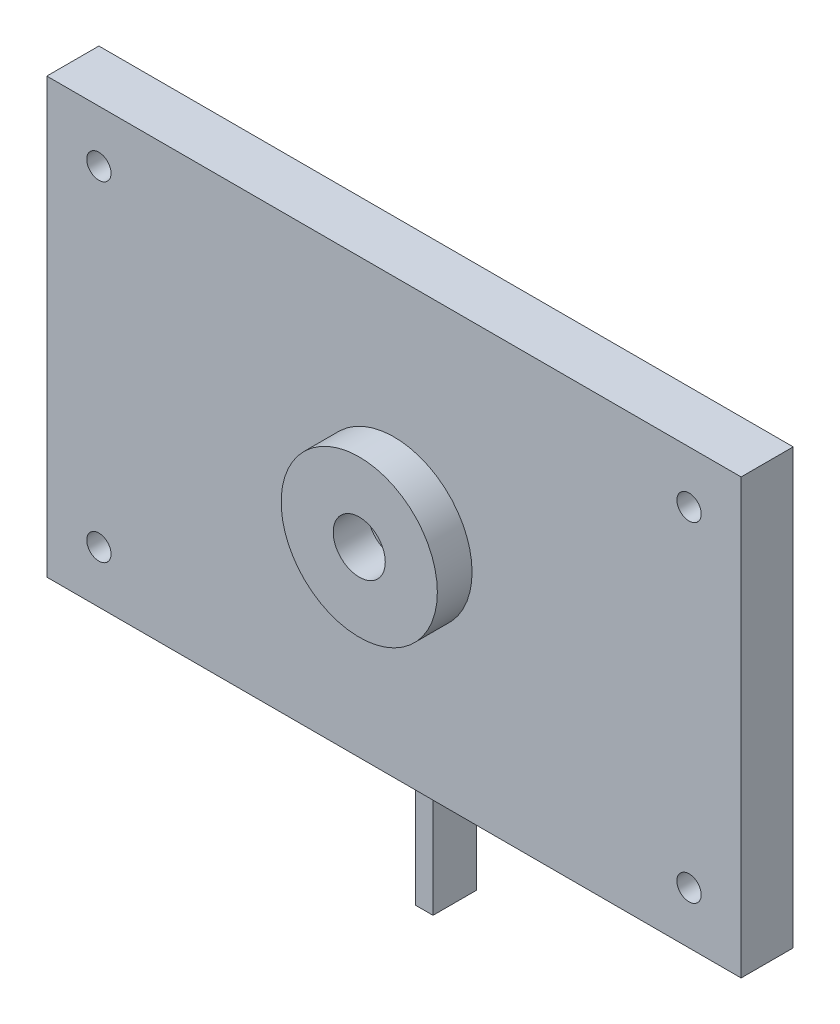
ISO-10303-21;
HEADER;
FILE_DESCRIPTION(('STEP AP214'),'2;1');
FILE_NAME('part.step','',(''),(''),'','','');
FILE_SCHEMA(('AUTOMOTIVE_DESIGN { 1 0 10303 214 1 1 1 1 }'));
ENDSEC;
DATA;
#1=APPLICATION_CONTEXT('core data for automotive mechanical design processes');
#2=APPLICATION_PROTOCOL_DEFINITION('international standard','automotive_design',2000,#1);
#3=PRODUCT_CONTEXT('',#1,'mechanical');
#4=PRODUCT('Part','Part','',(#3));
#5=PRODUCT_RELATED_PRODUCT_CATEGORY('part','',(#4));
#6=PRODUCT_DEFINITION_FORMATION('','',#4);
#7=PRODUCT_DEFINITION_CONTEXT('part definition',#1,'design');
#8=PRODUCT_DEFINITION('design','',#6,#7);
#9=PRODUCT_DEFINITION_SHAPE('','',#8);
#10=(LENGTH_UNIT() NAMED_UNIT(*) SI_UNIT(.MILLI.,.METRE.));
#11=(NAMED_UNIT(*) PLANE_ANGLE_UNIT() SI_UNIT($,.RADIAN.));
#12=(NAMED_UNIT(*) SI_UNIT($,.STERADIAN.) SOLID_ANGLE_UNIT());
#13=UNCERTAINTY_MEASURE_WITH_UNIT(LENGTH_MEASURE(1.E-05),#10,'distance_accuracy_value','');
#14=(GEOMETRIC_REPRESENTATION_CONTEXT(3) GLOBAL_UNCERTAINTY_ASSIGNED_CONTEXT((#13)) GLOBAL_UNIT_ASSIGNED_CONTEXT((#10,
#11,#12)) REPRESENTATION_CONTEXT('',''));
#15=CARTESIAN_POINT('',(0.,0.,0.));
#16=DIRECTION('',(0.,0.,1.));
#17=DIRECTION('',(1.,0.,0.));
#18=AXIS2_PLACEMENT_3D('',#15,#16,#17);
#19=CARTESIAN_POINT('',(0.,0.,30.));
#20=DIRECTION('',(0.,0.,1.));
#21=DIRECTION('',(1.,0.,0.));
#22=AXIS2_PLACEMENT_3D('',#19,#20,#21);
#23=PLANE('',#22);
#24=CARTESIAN_POINT('',(0.,0.,30.));
#25=DIRECTION('',(0.,0.,-1.));
#26=DIRECTION('',(1.,0.,0.));
#27=AXIS2_PLACEMENT_3D('',#24,#25,#26);
#28=CIRCLE('',#27,15.);
#29=CARTESIAN_POINT('',(15.,0.,30.));
#30=VERTEX_POINT('',#29);
#31=EDGE_CURVE('E10',#30,#30,#28,.T.);
#32=ORIENTED_EDGE('',*,*,#31,.F.);
#33=EDGE_LOOP('',(#32));
#34=FACE_BOUND('',#33,.T.);
#35=ADVANCED_FACE('F16',(#34),#23,.T.);
#36=CARTESIAN_POINT('',(0.,0.,0.));
#37=DIRECTION('',(0.,0.,-1.));
#38=DIRECTION('',(1.,0.,0.));
#39=AXIS2_PLACEMENT_3D('',#36,#37,#38);
#40=CYLINDRICAL_SURFACE('',#39,15.);
#41=DIRECTION('',(0.,0.,1.));
#42=VECTOR('',#41,1.);
#43=CARTESIAN_POINT('',(15.,0.,0.));
#44=LINE('',#43,#42);
#45=CARTESIAN_POINT('',(15.,0.,50.));
#46=VERTEX_POINT('',#45);
#47=EDGE_CURVE('E24',#30,#46,#44,.T.);
#48=ORIENTED_EDGE('',*,*,#47,.F.);
#49=ORIENTED_EDGE('',*,*,#31,.T.);
#50=ORIENTED_EDGE('',*,*,#47,.T.);
#51=CARTESIAN_POINT('',(0.,0.,50.));
#52=DIRECTION('',(0.,0.,-1.));
#53=DIRECTION('',(1.,0.,0.));
#54=AXIS2_PLACEMENT_3D('',#51,#52,#53);
#55=CIRCLE('',#54,15.);
#56=EDGE_CURVE('E308',#46,#46,#55,.T.);
#57=ORIENTED_EDGE('',*,*,#56,.F.);
#58=EDGE_LOOP('',(#48,#49,#50,#57));
#59=FACE_BOUND('',#58,.T.);
#60=ADVANCED_FACE('F340',(#59),#40,.F.);
#61=CARTESIAN_POINT('',(0.,0.,50.));
#62=DIRECTION('',(0.,0.,1.));
#63=DIRECTION('',(1.,0.,0.));
#64=AXIS2_PLACEMENT_3D('',#61,#62,#63);
#65=PLANE('',#64);
#66=ORIENTED_EDGE('',*,*,#56,.T.);
#67=EDGE_LOOP('',(#66));
#68=FACE_BOUND('',#67,.T.);
#69=CARTESIAN_POINT('',(0.,0.,50.));
#70=DIRECTION('',(0.,0.,1.));
#71=DIRECTION('',(1.,0.,0.));
#72=AXIS2_PLACEMENT_3D('',#69,#70,#71);
#73=CIRCLE('',#72,45.);
#74=CARTESIAN_POINT('',(45.,0.,50.));
#75=VERTEX_POINT('',#74);
#76=EDGE_CURVE('E333',#75,#75,#73,.T.);
#77=ORIENTED_EDGE('',*,*,#76,.T.);
#78=EDGE_LOOP('',(#77));
#79=FACE_BOUND('',#78,.T.);
#80=ADVANCED_FACE('F338',(#68,#79),#65,.T.);
#81=CARTESIAN_POINT('',(0.,0.,0.));
#82=DIRECTION('',(0.,0.,1.));
#83=DIRECTION('',(1.,0.,0.));
#84=AXIS2_PLACEMENT_3D('',#81,#82,#83);
#85=CYLINDRICAL_SURFACE('',#84,45.);
#86=DIRECTION('',(0.,0.,1.));
#87=VECTOR('',#86,1.);
#88=CARTESIAN_POINT('',(45.,0.,0.));
#89=LINE('',#88,#87);
#90=CARTESIAN_POINT('',(45.,0.,30.));
#91=VERTEX_POINT('',#90);
#92=EDGE_CURVE('E301',#91,#75,#89,.T.);
#93=ORIENTED_EDGE('',*,*,#92,.F.);
#94=CARTESIAN_POINT('',(0.,0.,30.));
#95=DIRECTION('',(0.,0.,1.));
#96=DIRECTION('',(1.,0.,0.));
#97=AXIS2_PLACEMENT_3D('',#94,#95,#96);
#98=CIRCLE('',#97,45.);
#99=EDGE_CURVE('E222',#91,#91,#98,.T.);
#100=ORIENTED_EDGE('',*,*,#99,.T.);
#101=ORIENTED_EDGE('',*,*,#92,.T.);
#102=ORIENTED_EDGE('',*,*,#76,.F.);
#103=EDGE_LOOP('',(#93,#100,#101,#102));
#104=FACE_BOUND('',#103,.T.);
#105=ADVANCED_FACE('F347',(#104),#85,.T.);
#106=CARTESIAN_POINT('',(0.,0.,0.));
#107=DIRECTION('',(0.,-1.,0.));
#108=DIRECTION('',(0.,0.,-1.));
#109=AXIS2_PLACEMENT_3D('',#106,#107,#108);
#110=PLANE('',#109);
#111=DIRECTION('',(1.,0.,0.));
#112=VECTOR('',#111,1.);
#113=CARTESIAN_POINT('',(0.,0.,0.));
#114=LINE('',#113,#112);
#115=CARTESIAN_POINT('',(-5.,0.,0.));
#116=VERTEX_POINT('',#115);
#117=CARTESIAN_POINT('',(5.,0.,0.));
#118=VERTEX_POINT('',#117);
#119=EDGE_CURVE('E239',#116,#118,#114,.T.);
#120=ORIENTED_EDGE('',*,*,#119,.T.);
#121=DIRECTION('',(0.,0.,1.));
#122=VECTOR('',#121,1.);
#123=CARTESIAN_POINT('',(5.,0.,-12.5));
#124=LINE('',#123,#122);
#125=CARTESIAN_POINT('',(5.,0.,-12.5));
#126=VERTEX_POINT('',#125);
#127=EDGE_CURVE('E277',#126,#118,#124,.T.);
#128=ORIENTED_EDGE('',*,*,#127,.F.);
#129=DIRECTION('',(1.,0.,0.));
#130=VECTOR('',#129,1.);
#131=CARTESIAN_POINT('',(-5.,0.,-12.5));
#132=LINE('',#131,#130);
#133=CARTESIAN_POINT('',(-5.,0.,-12.5));
#134=VERTEX_POINT('',#133);
#135=EDGE_CURVE('E298',#134,#126,#132,.T.);
#136=ORIENTED_EDGE('',*,*,#135,.F.);
#137=DIRECTION('',(0.,0.,-1.));
#138=VECTOR('',#137,1.);
#139=CARTESIAN_POINT('',(-5.,0.,12.5));
#140=LINE('',#139,#138);
#141=EDGE_CURVE('E263',#116,#134,#140,.T.);
#142=ORIENTED_EDGE('',*,*,#141,.F.);
#143=EDGE_LOOP('',(#120,#128,#136,#142));
#144=FACE_BOUND('',#143,.T.);
#145=ADVANCED_FACE('F389',(#144),#110,.F.);
#146=CARTESIAN_POINT('',(-5.,0.,-12.5));
#147=DIRECTION('',(0.,0.,1.));
#148=DIRECTION('',(1.,0.,0.));
#149=AXIS2_PLACEMENT_3D('',#146,#147,#148);
#150=PLANE('',#149);
#151=ORIENTED_EDGE('',*,*,#135,.T.);
#152=DIRECTION('',(0.,-1.,0.));
#153=VECTOR('',#152,1.);
#154=CARTESIAN_POINT('',(5.,0.,-12.5));
#155=LINE('',#154,#153);
#156=CARTESIAN_POINT('',(5.,-200.,-12.5));
#157=VERTEX_POINT('',#156);
#158=EDGE_CURVE('E225',#126,#157,#155,.T.);
#159=ORIENTED_EDGE('',*,*,#158,.T.);
#160=DIRECTION('',(1.,0.,0.));
#161=VECTOR('',#160,1.);
#162=CARTESIAN_POINT('',(-5.,-200.,-12.5));
#163=LINE('',#162,#161);
#164=CARTESIAN_POINT('',(-5.,-200.,-12.5));
#165=VERTEX_POINT('',#164);
#166=EDGE_CURVE('E211',#165,#157,#163,.T.);
#167=ORIENTED_EDGE('',*,*,#166,.F.);
#168=DIRECTION('',(0.,-1.,0.));
#169=VECTOR('',#168,1.);
#170=CARTESIAN_POINT('',(-5.,0.,-12.5));
#171=LINE('',#170,#169);
#172=EDGE_CURVE('E267',#134,#165,#171,.T.);
#173=ORIENTED_EDGE('',*,*,#172,.F.);
#174=EDGE_LOOP('',(#151,#159,#167,#173));
#175=FACE_BOUND('',#174,.T.);
#176=ADVANCED_FACE('F355',(#175),#150,.F.);
#177=CARTESIAN_POINT('',(0.,-200.,0.));
#178=DIRECTION('',(0.,-1.,0.));
#179=DIRECTION('',(0.,0.,-1.));
#180=AXIS2_PLACEMENT_3D('',#177,#178,#179);
#181=PLANE('',#180);
#182=ORIENTED_EDGE('',*,*,#166,.T.);
#183=DIRECTION('',(0.,0.,1.));
#184=VECTOR('',#183,1.);
#185=CARTESIAN_POINT('',(5.,-200.,-12.5));
#186=LINE('',#185,#184);
#187=CARTESIAN_POINT('',(5.,-200.,12.5));
#188=VERTEX_POINT('',#187);
#189=EDGE_CURVE('E175',#157,#188,#186,.T.);
#190=ORIENTED_EDGE('',*,*,#189,.T.);
#191=DIRECTION('',(-1.,0.,0.));
#192=VECTOR('',#191,1.);
#193=CARTESIAN_POINT('',(5.,-200.,12.5));
#194=LINE('',#193,#192);
#195=CARTESIAN_POINT('',(-5.,-200.,12.5));
#196=VERTEX_POINT('',#195);
#197=EDGE_CURVE('E171',#188,#196,#194,.T.);
#198=ORIENTED_EDGE('',*,*,#197,.T.);
#199=DIRECTION('',(0.,0.,-1.));
#200=VECTOR('',#199,1.);
#201=CARTESIAN_POINT('',(-5.,-200.,12.5));
#202=LINE('',#201,#200);
#203=EDGE_CURVE('E268',#196,#165,#202,.T.);
#204=ORIENTED_EDGE('',*,*,#203,.T.);
#205=EDGE_LOOP('',(#182,#190,#198,#204));
#206=FACE_BOUND('',#205,.T.);
#207=ADVANCED_FACE('F351',(#206),#181,.T.);
#208=CARTESIAN_POINT('',(170.,95.,0.));
#209=DIRECTION('',(0.,0.,-1.));
#210=DIRECTION('',(1.,0.,0.));
#211=AXIS2_PLACEMENT_3D('',#208,#209,#210);
#212=CYLINDRICAL_SURFACE('',#211,7.);
#213=CARTESIAN_POINT('',(170.,95.,0.));
#214=DIRECTION('',(0.,0.,1.));
#215=DIRECTION('',(1.,0.,0.));
#216=AXIS2_PLACEMENT_3D('',#213,#214,#215);
#217=CIRCLE('',#216,7.);
#218=CARTESIAN_POINT('',(177.,95.,0.));
#219=VERTEX_POINT('',#218);
#220=EDGE_CURVE('E259',#219,#219,#217,.T.);
#221=ORIENTED_EDGE('',*,*,#220,.F.);
#222=DIRECTION('',(0.,0.,1.));
#223=VECTOR('',#222,1.);
#224=CARTESIAN_POINT('',(177.,95.,0.));
#225=LINE('',#224,#223);
#226=CARTESIAN_POINT('',(177.,95.,30.));
#227=VERTEX_POINT('',#226);
#228=EDGE_CURVE('E208',#219,#227,#225,.T.);
#229=ORIENTED_EDGE('',*,*,#228,.T.);
#230=CARTESIAN_POINT('',(170.,95.,30.));
#231=DIRECTION('',(0.,0.,-1.));
#232=DIRECTION('',(1.,0.,0.));
#233=AXIS2_PLACEMENT_3D('',#230,#231,#232);
#234=CIRCLE('',#233,7.);
#235=EDGE_CURVE('E217',#227,#227,#234,.T.);
#236=ORIENTED_EDGE('',*,*,#235,.F.);
#237=ORIENTED_EDGE('',*,*,#228,.F.);
#238=EDGE_LOOP('',(#221,#229,#236,#237));
#239=FACE_BOUND('',#238,.T.);
#240=ADVANCED_FACE('F354',(#239),#212,.F.);
#241=CARTESIAN_POINT('',(-170.,95.,0.));
#242=DIRECTION('',(0.,0.,-1.));
#243=DIRECTION('',(1.,0.,0.));
#244=AXIS2_PLACEMENT_3D('',#241,#242,#243);
#245=CYLINDRICAL_SURFACE('',#244,7.);
#246=CARTESIAN_POINT('',(-170.,95.,0.));
#247=DIRECTION('',(0.,0.,1.));
#248=DIRECTION('',(1.,0.,0.));
#249=AXIS2_PLACEMENT_3D('',#246,#247,#248);
#250=CIRCLE('',#249,7.);
#251=CARTESIAN_POINT('',(-163.,95.,0.));
#252=VERTEX_POINT('',#251);
#253=EDGE_CURVE('E244',#252,#252,#250,.T.);
#254=ORIENTED_EDGE('',*,*,#253,.F.);
#255=DIRECTION('',(0.,0.,1.));
#256=VECTOR('',#255,1.);
#257=CARTESIAN_POINT('',(-163.,95.,0.));
#258=LINE('',#257,#256);
#259=CARTESIAN_POINT('',(-163.,95.,30.));
#260=VERTEX_POINT('',#259);
#261=EDGE_CURVE('E212',#252,#260,#258,.T.);
#262=ORIENTED_EDGE('',*,*,#261,.T.);
#263=CARTESIAN_POINT('',(-170.,95.,30.));
#264=DIRECTION('',(0.,0.,-1.));
#265=DIRECTION('',(1.,0.,0.));
#266=AXIS2_PLACEMENT_3D('',#263,#264,#265);
#267=CIRCLE('',#266,7.);
#268=EDGE_CURVE('E292',#260,#260,#267,.T.);
#269=ORIENTED_EDGE('',*,*,#268,.F.);
#270=ORIENTED_EDGE('',*,*,#261,.F.);
#271=EDGE_LOOP('',(#254,#262,#269,#270));
#272=FACE_BOUND('',#271,.T.);
#273=ADVANCED_FACE('F359',(#272),#245,.F.);
#274=CARTESIAN_POINT('',(170.,-95.,0.));
#275=DIRECTION('',(0.,0.,-1.));
#276=DIRECTION('',(1.,0.,0.));
#277=AXIS2_PLACEMENT_3D('',#274,#275,#276);
#278=CYLINDRICAL_SURFACE('',#277,7.);
#279=CARTESIAN_POINT('',(170.,-95.,0.));
#280=DIRECTION('',(0.,0.,1.));
#281=DIRECTION('',(1.,0.,0.));
#282=AXIS2_PLACEMENT_3D('',#279,#280,#281);
#283=CIRCLE('',#282,7.);
#284=CARTESIAN_POINT('',(177.,-95.,0.));
#285=VERTEX_POINT('',#284);
#286=EDGE_CURVE('E240',#285,#285,#283,.T.);
#287=ORIENTED_EDGE('',*,*,#286,.F.);
#288=DIRECTION('',(0.,0.,1.));
#289=VECTOR('',#288,1.);
#290=CARTESIAN_POINT('',(177.,-95.,0.));
#291=LINE('',#290,#289);
#292=CARTESIAN_POINT('',(177.,-95.,30.));
#293=VERTEX_POINT('',#292);
#294=EDGE_CURVE('E323',#285,#293,#291,.T.);
#295=ORIENTED_EDGE('',*,*,#294,.T.);
#296=CARTESIAN_POINT('',(170.,-95.,30.));
#297=DIRECTION('',(0.,0.,-1.));
#298=DIRECTION('',(1.,0.,0.));
#299=AXIS2_PLACEMENT_3D('',#296,#297,#298);
#300=CIRCLE('',#299,7.);
#301=EDGE_CURVE('E288',#293,#293,#300,.T.);
#302=ORIENTED_EDGE('',*,*,#301,.F.);
#303=ORIENTED_EDGE('',*,*,#294,.F.);
#304=EDGE_LOOP('',(#287,#295,#302,#303));
#305=FACE_BOUND('',#304,.T.);
#306=ADVANCED_FACE('F365',(#305),#278,.F.);
#307=CARTESIAN_POINT('',(-170.,-95.,0.));
#308=DIRECTION('',(0.,0.,-1.));
#309=DIRECTION('',(1.,0.,0.));
#310=AXIS2_PLACEMENT_3D('',#307,#308,#309);
#311=CYLINDRICAL_SURFACE('',#310,7.);
#312=CARTESIAN_POINT('',(-170.,-95.,0.));
#313=DIRECTION('',(0.,0.,1.));
#314=DIRECTION('',(1.,0.,0.));
#315=AXIS2_PLACEMENT_3D('',#312,#313,#314);
#316=CIRCLE('',#315,7.);
#317=CARTESIAN_POINT('',(-163.,-95.,0.));
#318=VERTEX_POINT('',#317);
#319=EDGE_CURVE('E206',#318,#318,#316,.T.);
#320=ORIENTED_EDGE('',*,*,#319,.F.);
#321=DIRECTION('',(0.,0.,1.));
#322=VECTOR('',#321,1.);
#323=CARTESIAN_POINT('',(-163.,-95.,0.));
#324=LINE('',#323,#322);
#325=CARTESIAN_POINT('',(-163.,-95.,30.));
#326=VERTEX_POINT('',#325);
#327=EDGE_CURVE('E320',#318,#326,#324,.T.);
#328=ORIENTED_EDGE('',*,*,#327,.T.);
#329=CARTESIAN_POINT('',(-170.,-95.,30.));
#330=DIRECTION('',(0.,0.,-1.));
#331=DIRECTION('',(1.,0.,0.));
#332=AXIS2_PLACEMENT_3D('',#329,#330,#331);
#333=CIRCLE('',#332,7.);
#334=EDGE_CURVE('E293',#326,#326,#333,.T.);
#335=ORIENTED_EDGE('',*,*,#334,.F.);
#336=ORIENTED_EDGE('',*,*,#327,.F.);
#337=EDGE_LOOP('',(#320,#328,#335,#336));
#338=FACE_BOUND('',#337,.T.);
#339=ADVANCED_FACE('F361',(#338),#311,.F.);
#340=CARTESIAN_POINT('',(200.,125.,0.));
#341=DIRECTION('',(0.,-1.,0.));
#342=DIRECTION('',(0.,0.,-1.));
#343=AXIS2_PLACEMENT_3D('',#340,#341,#342);
#344=PLANE('',#343);
#345=DIRECTION('',(-1.,0.,0.));
#346=VECTOR('',#345,1.);
#347=CARTESIAN_POINT('',(200.,125.,0.));
#348=LINE('',#347,#346);
#349=CARTESIAN_POINT('',(200.,125.,0.));
#350=VERTEX_POINT('',#349);
#351=CARTESIAN_POINT('',(-200.,125.,0.));
#352=VERTEX_POINT('',#351);
#353=EDGE_CURVE('E207',#350,#352,#348,.T.);
#354=ORIENTED_EDGE('',*,*,#353,.T.);
#355=DIRECTION('',(0.,0.,1.));
#356=VECTOR('',#355,1.);
#357=CARTESIAN_POINT('',(-200.,125.,0.));
#358=LINE('',#357,#356);
#359=CARTESIAN_POINT('',(-200.,125.,30.));
#360=VERTEX_POINT('',#359);
#361=EDGE_CURVE('E221',#352,#360,#358,.T.);
#362=ORIENTED_EDGE('',*,*,#361,.T.);
#363=DIRECTION('',(-1.,0.,0.));
#364=VECTOR('',#363,1.);
#365=CARTESIAN_POINT('',(200.,125.,30.));
#366=LINE('',#365,#364);
#367=CARTESIAN_POINT('',(200.,125.,30.));
#368=VERTEX_POINT('',#367);
#369=EDGE_CURVE('E297',#368,#360,#366,.T.);
#370=ORIENTED_EDGE('',*,*,#369,.F.);
#371=DIRECTION('',(0.,0.,1.));
#372=VECTOR('',#371,1.);
#373=CARTESIAN_POINT('',(200.,125.,0.));
#374=LINE('',#373,#372);
#375=EDGE_CURVE('E279',#350,#368,#374,.T.);
#376=ORIENTED_EDGE('',*,*,#375,.F.);
#377=EDGE_LOOP('',(#354,#362,#370,#376));
#378=FACE_BOUND('',#377,.T.);
#379=ADVANCED_FACE('F364',(#378),#344,.F.);
#380=CARTESIAN_POINT('',(-200.,125.,0.));
#381=DIRECTION('',(1.,0.,0.));
#382=DIRECTION('',(0.,1.,0.));
#383=AXIS2_PLACEMENT_3D('',#380,#381,#382);
#384=PLANE('',#383);
#385=DIRECTION('',(0.,-1.,0.));
#386=VECTOR('',#385,1.);
#387=CARTESIAN_POINT('',(-200.,125.,0.));
#388=LINE('',#387,#386);
#389=CARTESIAN_POINT('',(-200.,-125.,0.));
#390=VERTEX_POINT('',#389);
#391=EDGE_CURVE('E233',#352,#390,#388,.T.);
#392=ORIENTED_EDGE('',*,*,#391,.T.);
#393=DIRECTION('',(0.,0.,1.));
#394=VECTOR('',#393,1.);
#395=CARTESIAN_POINT('',(-200.,-125.,0.));
#396=LINE('',#395,#394);
#397=CARTESIAN_POINT('',(-200.,-125.,30.));
#398=VERTEX_POINT('',#397);
#399=EDGE_CURVE('E215',#390,#398,#396,.T.);
#400=ORIENTED_EDGE('',*,*,#399,.T.);
#401=DIRECTION('',(0.,-1.,0.));
#402=VECTOR('',#401,1.);
#403=CARTESIAN_POINT('',(-200.,125.,30.));
#404=LINE('',#403,#402);
#405=EDGE_CURVE('E305',#360,#398,#404,.T.);
#406=ORIENTED_EDGE('',*,*,#405,.F.);
#407=ORIENTED_EDGE('',*,*,#361,.F.);
#408=EDGE_LOOP('',(#392,#400,#406,#407));
#409=FACE_BOUND('',#408,.T.);
#410=ADVANCED_FACE('F367',(#409),#384,.F.);
#411=CARTESIAN_POINT('',(0.,0.,30.));
#412=DIRECTION('',(0.,0.,1.));
#413=DIRECTION('',(1.,0.,0.));
#414=AXIS2_PLACEMENT_3D('',#411,#412,#413);
#415=PLANE('',#414);
#416=ORIENTED_EDGE('',*,*,#235,.T.);
#417=EDGE_LOOP('',(#416));
#418=FACE_BOUND('',#417,.T.);
#419=ORIENTED_EDGE('',*,*,#99,.F.);
#420=EDGE_LOOP('',(#419));
#421=FACE_BOUND('',#420,.T.);
#422=ORIENTED_EDGE('',*,*,#268,.T.);
#423=EDGE_LOOP('',(#422));
#424=FACE_BOUND('',#423,.T.);
#425=ORIENTED_EDGE('',*,*,#301,.T.);
#426=EDGE_LOOP('',(#425));
#427=FACE_BOUND('',#426,.T.);
#428=ORIENTED_EDGE('',*,*,#334,.T.);
#429=EDGE_LOOP('',(#428));
#430=FACE_BOUND('',#429,.T.);
#431=DIRECTION('',(1.,0.,0.));
#432=VECTOR('',#431,1.);
#433=CARTESIAN_POINT('',(-200.,-125.,30.));
#434=LINE('',#433,#432);
#435=CARTESIAN_POINT('',(200.,-125.,30.));
#436=VERTEX_POINT('',#435);
#437=EDGE_CURVE('E226',#398,#436,#434,.T.);
#438=ORIENTED_EDGE('',*,*,#437,.T.);
#439=DIRECTION('',(0.,1.,0.));
#440=VECTOR('',#439,1.);
#441=CARTESIAN_POINT('',(200.,-125.,30.));
#442=LINE('',#441,#440);
#443=EDGE_CURVE('E287',#436,#368,#442,.T.);
#444=ORIENTED_EDGE('',*,*,#443,.T.);
#445=ORIENTED_EDGE('',*,*,#369,.T.);
#446=ORIENTED_EDGE('',*,*,#405,.T.);
#447=EDGE_LOOP('',(#438,#444,#445,#446));
#448=FACE_BOUND('',#447,.T.);
#449=ADVANCED_FACE('F370',(#418,#421,#424,#427,#430,#448),#415,.T.);
#450=CARTESIAN_POINT('',(200.,-125.,0.));
#451=DIRECTION('',(-1.,0.,0.));
#452=DIRECTION('',(0.,0.,1.));
#453=AXIS2_PLACEMENT_3D('',#450,#451,#452);
#454=PLANE('',#453);
#455=DIRECTION('',(0.,1.,0.));
#456=VECTOR('',#455,1.);
#457=CARTESIAN_POINT('',(200.,-125.,0.));
#458=LINE('',#457,#456);
#459=CARTESIAN_POINT('',(200.,-125.,0.));
#460=VERTEX_POINT('',#459);
#461=EDGE_CURVE('E203',#460,#350,#458,.T.);
#462=ORIENTED_EDGE('',*,*,#461,.T.);
#463=ORIENTED_EDGE('',*,*,#375,.T.);
#464=ORIENTED_EDGE('',*,*,#443,.F.);
#465=DIRECTION('',(0.,0.,1.));
#466=VECTOR('',#465,1.);
#467=CARTESIAN_POINT('',(200.,-125.,0.));
#468=LINE('',#467,#466);
#469=EDGE_CURVE('E201',#460,#436,#468,.T.);
#470=ORIENTED_EDGE('',*,*,#469,.F.);
#471=EDGE_LOOP('',(#462,#463,#464,#470));
#472=FACE_BOUND('',#471,.T.);
#473=ADVANCED_FACE('F374',(#472),#454,.F.);
#474=CARTESIAN_POINT('',(5.,0.,-12.5));
#475=DIRECTION('',(-1.,0.,0.));
#476=DIRECTION('',(0.,0.,1.));
#477=AXIS2_PLACEMENT_3D('',#474,#475,#476);
#478=PLANE('',#477);
#479=DIRECTION('',(0.,1.,0.));
#480=VECTOR('',#479,1.);
#481=CARTESIAN_POINT('',(5.,-125.,0.));
#482=LINE('',#481,#480);
#483=CARTESIAN_POINT('',(5.,-125.,0.));
#484=VERTEX_POINT('',#483);
#485=EDGE_CURVE('E181',#484,#118,#482,.T.);
#486=ORIENTED_EDGE('',*,*,#485,.F.);
#487=DIRECTION('',(0.,0.,1.));
#488=VECTOR('',#487,1.);
#489=CARTESIAN_POINT('',(5.,-125.,-6.25));
#490=LINE('',#489,#488);
#491=CARTESIAN_POINT('',(5.,-125.,12.5));
#492=VERTEX_POINT('',#491);
#493=EDGE_CURVE('E178',#484,#492,#490,.T.);
#494=ORIENTED_EDGE('',*,*,#493,.T.);
#495=DIRECTION('',(0.,-1.,0.));
#496=VECTOR('',#495,1.);
#497=CARTESIAN_POINT('',(5.,0.,12.5));
#498=LINE('',#497,#496);
#499=EDGE_CURVE('E164',#492,#188,#498,.T.);
#500=ORIENTED_EDGE('',*,*,#499,.T.);
#501=ORIENTED_EDGE('',*,*,#189,.F.);
#502=ORIENTED_EDGE('',*,*,#158,.F.);
#503=ORIENTED_EDGE('',*,*,#127,.T.);
#504=EDGE_LOOP('',(#486,#494,#500,#501,#502,#503));
#505=FACE_BOUND('',#504,.T.);
#506=ADVANCED_FACE('F179',(#505),#478,.F.);
#507=CARTESIAN_POINT('',(5.,0.,12.5));
#508=DIRECTION('',(0.,0.,-1.));
#509=DIRECTION('',(0.,-1.,0.));
#510=AXIS2_PLACEMENT_3D('',#507,#508,#509);
#511=PLANE('',#510);
#512=DIRECTION('',(0.,-1.,0.));
#513=VECTOR('',#512,1.);
#514=CARTESIAN_POINT('',(-5.,0.,12.5));
#515=LINE('',#514,#513);
#516=CARTESIAN_POINT('',(-5.,-125.,12.5));
#517=VERTEX_POINT('',#516);
#518=EDGE_CURVE('E272',#517,#196,#515,.T.);
#519=ORIENTED_EDGE('',*,*,#518,.T.);
#520=ORIENTED_EDGE('',*,*,#197,.F.);
#521=ORIENTED_EDGE('',*,*,#499,.F.);
#522=DIRECTION('',(-1.,0.,0.));
#523=VECTOR('',#522,1.);
#524=CARTESIAN_POINT('',(-97.5,-125.,12.5));
#525=LINE('',#524,#523);
#526=EDGE_CURVE('E169',#492,#517,#525,.T.);
#527=ORIENTED_EDGE('',*,*,#526,.T.);
#528=EDGE_LOOP('',(#519,#520,#521,#527));
#529=FACE_BOUND('',#528,.T.);
#530=ADVANCED_FACE('F167',(#529),#511,.F.);
#531=CARTESIAN_POINT('',(-5.,0.,12.5));
#532=DIRECTION('',(1.,0.,0.));
#533=DIRECTION('',(0.,1.,0.));
#534=AXIS2_PLACEMENT_3D('',#531,#532,#533);
#535=PLANE('',#534);
#536=DIRECTION('',(0.,-1.,0.));
#537=VECTOR('',#536,1.);
#538=CARTESIAN_POINT('',(-5.,0.,0.));
#539=LINE('',#538,#537);
#540=CARTESIAN_POINT('',(-5.,-125.,0.));
#541=VERTEX_POINT('',#540);
#542=EDGE_CURVE('E248',#116,#541,#539,.T.);
#543=ORIENTED_EDGE('',*,*,#542,.F.);
#544=ORIENTED_EDGE('',*,*,#141,.T.);
#545=ORIENTED_EDGE('',*,*,#172,.T.);
#546=ORIENTED_EDGE('',*,*,#203,.F.);
#547=ORIENTED_EDGE('',*,*,#518,.F.);
#548=DIRECTION('',(0.,0.,-1.));
#549=VECTOR('',#548,1.);
#550=CARTESIAN_POINT('',(-5.,-125.,6.25));
#551=LINE('',#550,#549);
#552=EDGE_CURVE('E191',#517,#541,#551,.T.);
#553=ORIENTED_EDGE('',*,*,#552,.T.);
#554=EDGE_LOOP('',(#543,#544,#545,#546,#547,#553));
#555=FACE_BOUND('',#554,.T.);
#556=ADVANCED_FACE('F386',(#555),#535,.F.);
#557=CARTESIAN_POINT('',(0.,0.,0.));
#558=DIRECTION('',(0.,0.,1.));
#559=DIRECTION('',(1.,0.,0.));
#560=AXIS2_PLACEMENT_3D('',#557,#558,#559);
#561=PLANE('',#560);
#562=ORIENTED_EDGE('',*,*,#220,.T.);
#563=EDGE_LOOP('',(#562));
#564=FACE_BOUND('',#563,.T.);
#565=ORIENTED_EDGE('',*,*,#253,.T.);
#566=EDGE_LOOP('',(#565));
#567=FACE_BOUND('',#566,.T.);
#568=ORIENTED_EDGE('',*,*,#286,.T.);
#569=EDGE_LOOP('',(#568));
#570=FACE_BOUND('',#569,.T.);
#571=ORIENTED_EDGE('',*,*,#319,.T.);
#572=EDGE_LOOP('',(#571));
#573=FACE_BOUND('',#572,.T.);
#574=DIRECTION('',(1.,0.,0.));
#575=VECTOR('',#574,1.);
#576=CARTESIAN_POINT('',(-200.,-125.,0.));
#577=LINE('',#576,#575);
#578=EDGE_CURVE('E186',#484,#460,#577,.T.);
#579=ORIENTED_EDGE('',*,*,#578,.F.);
#580=ORIENTED_EDGE('',*,*,#485,.T.);
#581=ORIENTED_EDGE('',*,*,#119,.F.);
#582=ORIENTED_EDGE('',*,*,#542,.T.);
#583=DIRECTION('',(1.,0.,0.));
#584=VECTOR('',#583,1.);
#585=CARTESIAN_POINT('',(-200.,-125.,0.));
#586=LINE('',#585,#584);
#587=EDGE_CURVE('E213',#390,#541,#586,.T.);
#588=ORIENTED_EDGE('',*,*,#587,.F.);
#589=ORIENTED_EDGE('',*,*,#391,.F.);
#590=ORIENTED_EDGE('',*,*,#353,.F.);
#591=ORIENTED_EDGE('',*,*,#461,.F.);
#592=EDGE_LOOP('',(#579,#580,#581,#582,#588,#589,#590,#591));
#593=FACE_BOUND('',#592,.T.);
#594=ADVANCED_FACE('F399',(#564,#567,#570,#573,#593),#561,.F.);
#595=CARTESIAN_POINT('',(-200.,-125.,0.));
#596=DIRECTION('',(0.,1.,0.));
#597=DIRECTION('',(1.,0.,0.));
#598=AXIS2_PLACEMENT_3D('',#595,#596,#597);
#599=PLANE('',#598);
#600=ORIENTED_EDGE('',*,*,#552,.F.);
#601=ORIENTED_EDGE('',*,*,#526,.F.);
#602=ORIENTED_EDGE('',*,*,#493,.F.);
#603=ORIENTED_EDGE('',*,*,#578,.T.);
#604=ORIENTED_EDGE('',*,*,#469,.T.);
#605=ORIENTED_EDGE('',*,*,#437,.F.);
#606=ORIENTED_EDGE('',*,*,#399,.F.);
#607=ORIENTED_EDGE('',*,*,#587,.T.);
#608=EDGE_LOOP('',(#600,#601,#602,#603,#604,#605,#606,#607));
#609=FACE_BOUND('',#608,.T.);
#610=ADVANCED_FACE('F188',(#609),#599,.F.);
#611=CLOSED_SHELL('',(#35,#60,#80,#105,#145,#176,#207,#240,#273,#306,#339,#379,#410,#449,#473,
#506,#530,#556,#594,#610));
#612=MANIFOLD_SOLID_BREP('B1',#611);
#613=ADVANCED_BREP_SHAPE_REPRESENTATION('',(#18,#612),#14);
#614=SHAPE_DEFINITION_REPRESENTATION(#9,#613);
ENDSEC;
END-ISO-10303-21;
